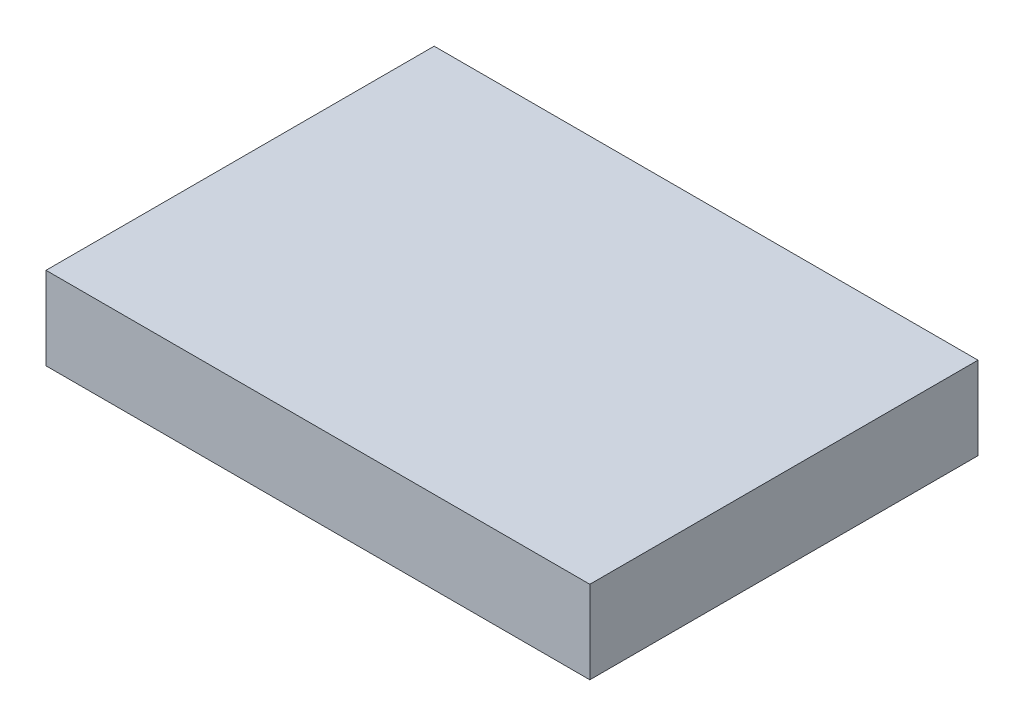
ISO-10303-21;
HEADER;
FILE_DESCRIPTION(('STEP AP214'),'2;1');
FILE_NAME('part.step','',(''),(''),'','','');
FILE_SCHEMA(('AUTOMOTIVE_DESIGN { 1 0 10303 214 1 1 1 1 }'));
ENDSEC;
DATA;
#1=APPLICATION_CONTEXT('core data for automotive mechanical design processes');
#2=APPLICATION_PROTOCOL_DEFINITION('international standard','automotive_design',2000,#1);
#3=PRODUCT_CONTEXT('',#1,'mechanical');
#4=PRODUCT('Part','Part','',(#3));
#5=PRODUCT_RELATED_PRODUCT_CATEGORY('part','',(#4));
#6=PRODUCT_DEFINITION_FORMATION('','',#4);
#7=PRODUCT_DEFINITION_CONTEXT('part definition',#1,'design');
#8=PRODUCT_DEFINITION('design','',#6,#7);
#9=PRODUCT_DEFINITION_SHAPE('','',#8);
#10=(LENGTH_UNIT() NAMED_UNIT(*) SI_UNIT(.MILLI.,.METRE.));
#11=(NAMED_UNIT(*) PLANE_ANGLE_UNIT() SI_UNIT($,.RADIAN.));
#12=(NAMED_UNIT(*) SI_UNIT($,.STERADIAN.) SOLID_ANGLE_UNIT());
#13=UNCERTAINTY_MEASURE_WITH_UNIT(LENGTH_MEASURE(1.E-05),#10,'distance_accuracy_value','');
#14=(GEOMETRIC_REPRESENTATION_CONTEXT(3) GLOBAL_UNCERTAINTY_ASSIGNED_CONTEXT((#13)) GLOBAL_UNIT_ASSIGNED_CONTEXT((#10,
#11,#12)) REPRESENTATION_CONTEXT('',''));
#15=CARTESIAN_POINT('',(0.,0.,0.));
#16=DIRECTION('',(0.,0.,1.));
#17=DIRECTION('',(1.,0.,0.));
#18=AXIS2_PLACEMENT_3D('',#15,#16,#17);
#19=CARTESIAN_POINT('',(35.052,10.668,25.019));
#20=DIRECTION('',(-1.,0.,0.));
#21=DIRECTION('',(0.,0.,1.));
#22=AXIS2_PLACEMENT_3D('',#19,#20,#21);
#23=PLANE('',#22);
#24=DIRECTION('',(0.,0.,-1.));
#25=VECTOR('',#24,1.);
#26=CARTESIAN_POINT('',(35.052,0.,25.019));
#27=LINE('',#26,#25);
#28=CARTESIAN_POINT('',(35.052,0.,25.019));
#29=VERTEX_POINT('',#28);
#30=CARTESIAN_POINT('',(35.052,0.,-25.019));
#31=VERTEX_POINT('',#30);
#32=EDGE_CURVE('E99',#29,#31,#27,.T.);
#33=ORIENTED_EDGE('',*,*,#32,.T.);
#34=DIRECTION('',(0.,-1.,0.));
#35=VECTOR('',#34,1.);
#36=CARTESIAN_POINT('',(35.052,10.668,-25.019));
#37=LINE('',#36,#35);
#38=CARTESIAN_POINT('',(35.052,10.668,-25.019));
#39=VERTEX_POINT('',#38);
#40=EDGE_CURVE('E11',#39,#31,#37,.T.);
#41=ORIENTED_EDGE('',*,*,#40,.F.);
#42=DIRECTION('',(0.,0.,-1.));
#43=VECTOR('',#42,1.);
#44=CARTESIAN_POINT('',(35.052,10.668,25.019));
#45=LINE('',#44,#43);
#46=CARTESIAN_POINT('',(35.052,10.668,25.019));
#47=VERTEX_POINT('',#46);
#48=EDGE_CURVE('E87',#47,#39,#45,.T.);
#49=ORIENTED_EDGE('',*,*,#48,.F.);
#50=DIRECTION('',(0.,-1.,0.));
#51=VECTOR('',#50,1.);
#52=CARTESIAN_POINT('',(35.052,10.668,25.019));
#53=LINE('',#52,#51);
#54=EDGE_CURVE('E95',#47,#29,#53,.T.);
#55=ORIENTED_EDGE('',*,*,#54,.T.);
#56=EDGE_LOOP('',(#33,#41,#49,#55));
#57=FACE_BOUND('',#56,.T.);
#58=ADVANCED_FACE('F36',(#57),#23,.F.);
#59=CARTESIAN_POINT('',(-35.052,10.668,-25.019));
#60=DIRECTION('',(0.,0.,1.));
#61=DIRECTION('',(1.,0.,0.));
#62=AXIS2_PLACEMENT_3D('',#59,#60,#61);
#63=PLANE('',#62);
#64=DIRECTION('',(-1.,0.,0.));
#65=VECTOR('',#64,1.);
#66=CARTESIAN_POINT('',(-35.052,0.,-25.019));
#67=LINE('',#66,#65);
#68=CARTESIAN_POINT('',(-35.052,0.,-25.019));
#69=VERTEX_POINT('',#68);
#70=EDGE_CURVE('E91',#31,#69,#67,.T.);
#71=ORIENTED_EDGE('',*,*,#70,.T.);
#72=DIRECTION('',(0.,-1.,0.));
#73=VECTOR('',#72,1.);
#74=CARTESIAN_POINT('',(-35.052,10.668,-25.019));
#75=LINE('',#74,#73);
#76=CARTESIAN_POINT('',(-35.052,10.668,-25.019));
#77=VERTEX_POINT('',#76);
#78=EDGE_CURVE('E44',#77,#69,#75,.T.);
#79=ORIENTED_EDGE('',*,*,#78,.F.);
#80=DIRECTION('',(-1.,0.,0.));
#81=VECTOR('',#80,1.);
#82=CARTESIAN_POINT('',(-35.052,10.668,-25.019));
#83=LINE('',#82,#81);
#84=EDGE_CURVE('E82',#39,#77,#83,.T.);
#85=ORIENTED_EDGE('',*,*,#84,.F.);
#86=ORIENTED_EDGE('',*,*,#40,.T.);
#87=EDGE_LOOP('',(#71,#79,#85,#86));
#88=FACE_BOUND('',#87,.T.);
#89=ADVANCED_FACE('F90',(#88),#63,.F.);
#90=CARTESIAN_POINT('',(-35.052,10.668,25.019));
#91=DIRECTION('',(1.,0.,0.));
#92=DIRECTION('',(0.,0.,-1.));
#93=AXIS2_PLACEMENT_3D('',#90,#91,#92);
#94=PLANE('',#93);
#95=DIRECTION('',(0.,0.,1.));
#96=VECTOR('',#95,1.);
#97=CARTESIAN_POINT('',(-35.052,0.,25.019));
#98=LINE('',#97,#96);
#99=CARTESIAN_POINT('',(-35.052,0.,25.019));
#100=VERTEX_POINT('',#99);
#101=EDGE_CURVE('E69',#69,#100,#98,.T.);
#102=ORIENTED_EDGE('',*,*,#101,.T.);
#103=DIRECTION('',(0.,-1.,0.));
#104=VECTOR('',#103,1.);
#105=CARTESIAN_POINT('',(-35.052,10.668,25.019));
#106=LINE('',#105,#104);
#107=CARTESIAN_POINT('',(-35.052,10.668,25.019));
#108=VERTEX_POINT('',#107);
#109=EDGE_CURVE('E92',#108,#100,#106,.T.);
#110=ORIENTED_EDGE('',*,*,#109,.F.);
#111=DIRECTION('',(0.,0.,1.));
#112=VECTOR('',#111,1.);
#113=CARTESIAN_POINT('',(-35.052,10.668,25.019));
#114=LINE('',#113,#112);
#115=EDGE_CURVE('E85',#77,#108,#114,.T.);
#116=ORIENTED_EDGE('',*,*,#115,.F.);
#117=ORIENTED_EDGE('',*,*,#78,.T.);
#118=EDGE_LOOP('',(#102,#110,#116,#117));
#119=FACE_BOUND('',#118,.T.);
#120=ADVANCED_FACE('F93',(#119),#94,.F.);
#121=CARTESIAN_POINT('',(-35.052,10.668,25.019));
#122=DIRECTION('',(0.,0.,-1.));
#123=DIRECTION('',(-1.,0.,0.));
#124=AXIS2_PLACEMENT_3D('',#121,#122,#123);
#125=PLANE('',#124);
#126=DIRECTION('',(1.,0.,0.));
#127=VECTOR('',#126,1.);
#128=CARTESIAN_POINT('',(-35.052,0.,25.019));
#129=LINE('',#128,#127);
#130=EDGE_CURVE('E75',#100,#29,#129,.T.);
#131=ORIENTED_EDGE('',*,*,#130,.T.);
#132=ORIENTED_EDGE('',*,*,#54,.F.);
#133=DIRECTION('',(1.,0.,0.));
#134=VECTOR('',#133,1.);
#135=CARTESIAN_POINT('',(-35.052,10.668,25.019));
#136=LINE('',#135,#134);
#137=EDGE_CURVE('E52',#108,#47,#136,.T.);
#138=ORIENTED_EDGE('',*,*,#137,.F.);
#139=ORIENTED_EDGE('',*,*,#109,.T.);
#140=EDGE_LOOP('',(#131,#132,#138,#139));
#141=FACE_BOUND('',#140,.T.);
#142=ADVANCED_FACE('F106',(#141),#125,.F.);
#143=CARTESIAN_POINT('',(0.,10.668,0.));
#144=DIRECTION('',(0.,-1.,0.));
#145=DIRECTION('',(0.,0.,-1.));
#146=AXIS2_PLACEMENT_3D('',#143,#144,#145);
#147=PLANE('',#146);
#148=ORIENTED_EDGE('',*,*,#48,.T.);
#149=ORIENTED_EDGE('',*,*,#84,.T.);
#150=ORIENTED_EDGE('',*,*,#115,.T.);
#151=ORIENTED_EDGE('',*,*,#137,.T.);
#152=EDGE_LOOP('',(#148,#149,#150,#151));
#153=FACE_BOUND('',#152,.T.);
#154=ADVANCED_FACE('F83',(#153),#147,.F.);
#155=CARTESIAN_POINT('',(0.,0.,0.));
#156=DIRECTION('',(0.,-1.,0.));
#157=DIRECTION('',(0.,0.,-1.));
#158=AXIS2_PLACEMENT_3D('',#155,#156,#157);
#159=PLANE('',#158);
#160=ORIENTED_EDGE('',*,*,#32,.F.);
#161=ORIENTED_EDGE('',*,*,#130,.F.);
#162=ORIENTED_EDGE('',*,*,#101,.F.);
#163=ORIENTED_EDGE('',*,*,#70,.F.);
#164=EDGE_LOOP('',(#160,#161,#162,#163));
#165=FACE_BOUND('',#164,.T.);
#166=ADVANCED_FACE('F109',(#165),#159,.T.);
#167=CLOSED_SHELL('',(#58,#89,#120,#142,#154,#166));
#168=MANIFOLD_SOLID_BREP('B2',#167);
#169=ADVANCED_BREP_SHAPE_REPRESENTATION('',(#18,#168),#14);
#170=SHAPE_DEFINITION_REPRESENTATION(#9,#169);
ENDSEC;
END-ISO-10303-21;
